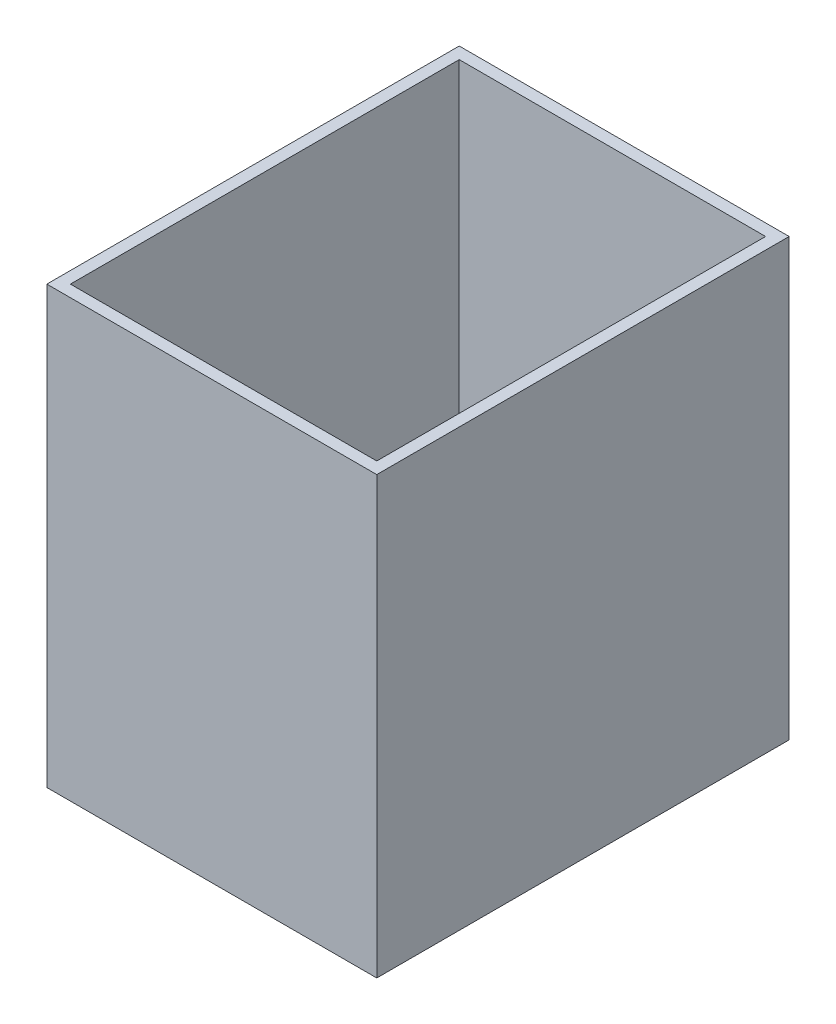
ISO-10303-21;
HEADER;
FILE_DESCRIPTION(('STEP AP214'),'2;1');
FILE_NAME('part.step','',(''),(''),'','','');
FILE_SCHEMA(('AUTOMOTIVE_DESIGN { 1 0 10303 214 1 1 1 1 }'));
ENDSEC;
DATA;
#1=APPLICATION_CONTEXT('core data for automotive mechanical design processes');
#2=APPLICATION_PROTOCOL_DEFINITION('international standard','automotive_design',2000,#1);
#3=PRODUCT_CONTEXT('',#1,'mechanical');
#4=PRODUCT('Part','Part','',(#3));
#5=PRODUCT_RELATED_PRODUCT_CATEGORY('part','',(#4));
#6=PRODUCT_DEFINITION_FORMATION('','',#4);
#7=PRODUCT_DEFINITION_CONTEXT('part definition',#1,'design');
#8=PRODUCT_DEFINITION('design','',#6,#7);
#9=PRODUCT_DEFINITION_SHAPE('','',#8);
#10=(LENGTH_UNIT() NAMED_UNIT(*) SI_UNIT(.MILLI.,.METRE.));
#11=(NAMED_UNIT(*) PLANE_ANGLE_UNIT() SI_UNIT($,.RADIAN.));
#12=(NAMED_UNIT(*) SI_UNIT($,.STERADIAN.) SOLID_ANGLE_UNIT());
#13=UNCERTAINTY_MEASURE_WITH_UNIT(LENGTH_MEASURE(1.E-05),#10,'distance_accuracy_value','');
#14=(GEOMETRIC_REPRESENTATION_CONTEXT(3) GLOBAL_UNCERTAINTY_ASSIGNED_CONTEXT((#13)) GLOBAL_UNIT_ASSIGNED_CONTEXT((#10,
#11,#12)) REPRESENTATION_CONTEXT('',''));
#15=CARTESIAN_POINT('',(0.,0.,0.));
#16=DIRECTION('',(0.,0.,1.));
#17=DIRECTION('',(1.,0.,0.));
#18=AXIS2_PLACEMENT_3D('',#15,#16,#17);
#19=CARTESIAN_POINT('',(-34.1113154934823,37.,-13.5993648044693));
#20=DIRECTION('',(0.,0.,1.));
#21=DIRECTION('',(1.,0.,0.));
#22=AXIS2_PLACEMENT_3D('',#19,#20,#21);
#23=PLANE('',#22);
#24=DIRECTION('',(-1.,0.,0.));
#25=VECTOR('',#24,1.);
#26=CARTESIAN_POINT('',(-34.1113154934823,0.,-13.5993648044693));
#27=LINE('',#26,#25);
#28=CARTESIAN_POINT('',(-6.11131549348231,0.,-13.5993648044693));
#29=VERTEX_POINT('',#28);
#30=CARTESIAN_POINT('',(-34.1113154934823,0.,-13.5993648044693));
#31=VERTEX_POINT('',#30);
#32=EDGE_CURVE('E163',#29,#31,#27,.T.);
#33=ORIENTED_EDGE('',*,*,#32,.T.);
#34=DIRECTION('',(0.,-1.,0.));
#35=VECTOR('',#34,1.);
#36=CARTESIAN_POINT('',(-34.1113154934823,37.,-13.5993648044693));
#37=LINE('',#36,#35);
#38=CARTESIAN_POINT('',(-34.1113154934823,37.,-13.5993648044693));
#39=VERTEX_POINT('',#38);
#40=EDGE_CURVE('E11',#39,#31,#37,.T.);
#41=ORIENTED_EDGE('',*,*,#40,.F.);
#42=DIRECTION('',(-1.,0.,0.));
#43=VECTOR('',#42,1.);
#44=CARTESIAN_POINT('',(-34.1113154934823,37.,-13.5993648044693));
#45=LINE('',#44,#43);
#46=CARTESIAN_POINT('',(-6.11131549348231,37.,-13.5993648044693));
#47=VERTEX_POINT('',#46);
#48=EDGE_CURVE('E169',#47,#39,#45,.T.);
#49=ORIENTED_EDGE('',*,*,#48,.F.);
#50=DIRECTION('',(0.,-1.,0.));
#51=VECTOR('',#50,1.);
#52=CARTESIAN_POINT('',(-6.11131549348231,37.,-13.5993648044693));
#53=LINE('',#52,#51);
#54=EDGE_CURVE('E179',#47,#29,#53,.T.);
#55=ORIENTED_EDGE('',*,*,#54,.T.);
#56=EDGE_LOOP('',(#33,#41,#49,#55));
#57=FACE_BOUND('',#56,.T.);
#58=ADVANCED_FACE('F45',(#57),#23,.F.);
#59=CARTESIAN_POINT('',(-34.1113154934823,37.,-13.5993648044693));
#60=DIRECTION('',(1.,0.,0.));
#61=DIRECTION('',(0.,0.,-1.));
#62=AXIS2_PLACEMENT_3D('',#59,#60,#61);
#63=PLANE('',#62);
#64=DIRECTION('',(0.,0.,1.));
#65=VECTOR('',#64,1.);
#66=CARTESIAN_POINT('',(-34.1113154934823,0.,-13.5993648044693));
#67=LINE('',#66,#65);
#68=CARTESIAN_POINT('',(-34.1113154934823,0.,21.4006351955307));
#69=VERTEX_POINT('',#68);
#70=EDGE_CURVE('E183',#31,#69,#67,.T.);
#71=ORIENTED_EDGE('',*,*,#70,.T.);
#72=DIRECTION('',(0.,-1.,0.));
#73=VECTOR('',#72,1.);
#74=CARTESIAN_POINT('',(-34.1113154934823,37.,21.4006351955307));
#75=LINE('',#74,#73);
#76=CARTESIAN_POINT('',(-34.1113154934823,37.,21.4006351955307));
#77=VERTEX_POINT('',#76);
#78=EDGE_CURVE('E53',#77,#69,#75,.T.);
#79=ORIENTED_EDGE('',*,*,#78,.F.);
#80=DIRECTION('',(0.,0.,1.));
#81=VECTOR('',#80,1.);
#82=CARTESIAN_POINT('',(-34.1113154934823,37.,-13.5993648044693));
#83=LINE('',#82,#81);
#84=EDGE_CURVE('E97',#39,#77,#83,.T.);
#85=ORIENTED_EDGE('',*,*,#84,.F.);
#86=ORIENTED_EDGE('',*,*,#40,.T.);
#87=EDGE_LOOP('',(#71,#79,#85,#86));
#88=FACE_BOUND('',#87,.T.);
#89=ADVANCED_FACE('F218',(#88),#63,.F.);
#90=CARTESIAN_POINT('',(-6.11131549348231,37.,21.4006351955307));
#91=DIRECTION('',(0.,0.,-1.));
#92=DIRECTION('',(-1.,0.,0.));
#93=AXIS2_PLACEMENT_3D('',#90,#91,#92);
#94=PLANE('',#93);
#95=DIRECTION('',(1.,0.,0.));
#96=VECTOR('',#95,1.);
#97=CARTESIAN_POINT('',(-6.11131549348231,0.,21.4006351955307));
#98=LINE('',#97,#96);
#99=CARTESIAN_POINT('',(-6.11131549348231,0.,21.4006351955307));
#100=VERTEX_POINT('',#99);
#101=EDGE_CURVE('E186',#69,#100,#98,.T.);
#102=ORIENTED_EDGE('',*,*,#101,.T.);
#103=DIRECTION('',(0.,-1.,0.));
#104=VECTOR('',#103,1.);
#105=CARTESIAN_POINT('',(-6.11131549348231,37.,21.4006351955307));
#106=LINE('',#105,#104);
#107=CARTESIAN_POINT('',(-6.11131549348231,37.,21.4006351955307));
#108=VERTEX_POINT('',#107);
#109=EDGE_CURVE('E193',#108,#100,#106,.T.);
#110=ORIENTED_EDGE('',*,*,#109,.F.);
#111=DIRECTION('',(1.,0.,0.));
#112=VECTOR('',#111,1.);
#113=CARTESIAN_POINT('',(-6.11131549348231,37.,21.4006351955307));
#114=LINE('',#113,#112);
#115=EDGE_CURVE('E174',#77,#108,#114,.T.);
#116=ORIENTED_EDGE('',*,*,#115,.F.);
#117=ORIENTED_EDGE('',*,*,#78,.T.);
#118=EDGE_LOOP('',(#102,#110,#116,#117));
#119=FACE_BOUND('',#118,.T.);
#120=ADVANCED_FACE('F200',(#119),#94,.F.);
#121=CARTESIAN_POINT('',(-6.11131549348231,37.,-13.5993648044693));
#122=DIRECTION('',(-1.,0.,0.));
#123=DIRECTION('',(0.,0.,1.));
#124=AXIS2_PLACEMENT_3D('',#121,#122,#123);
#125=PLANE('',#124);
#126=DIRECTION('',(0.,0.,-1.));
#127=VECTOR('',#126,1.);
#128=CARTESIAN_POINT('',(-6.11131549348231,0.,-13.5993648044693));
#129=LINE('',#128,#127);
#130=EDGE_CURVE('E90',#100,#29,#129,.T.);
#131=ORIENTED_EDGE('',*,*,#130,.T.);
#132=ORIENTED_EDGE('',*,*,#54,.F.);
#133=DIRECTION('',(0.,0.,-1.));
#134=VECTOR('',#133,1.);
#135=CARTESIAN_POINT('',(-6.11131549348231,37.,-13.5993648044693));
#136=LINE('',#135,#134);
#137=EDGE_CURVE('E69',#108,#47,#136,.T.);
#138=ORIENTED_EDGE('',*,*,#137,.F.);
#139=ORIENTED_EDGE('',*,*,#109,.T.);
#140=EDGE_LOOP('',(#131,#132,#138,#139));
#141=FACE_BOUND('',#140,.T.);
#142=ADVANCED_FACE('F208',(#141),#125,.F.);
#143=CARTESIAN_POINT('',(0.,37.,0.));
#144=DIRECTION('',(0.,-1.,0.));
#145=DIRECTION('',(0.,0.,-1.));
#146=AXIS2_PLACEMENT_3D('',#143,#144,#145);
#147=PLANE('',#146);
#148=DIRECTION('',(0.,0.,-1.));
#149=VECTOR('',#148,1.);
#150=CARTESIAN_POINT('',(-7.11131549348231,37.,0.));
#151=LINE('',#150,#149);
#152=CARTESIAN_POINT('',(-7.11131549348231,37.,20.4006351955307));
#153=VERTEX_POINT('',#152);
#154=CARTESIAN_POINT('',(-7.11131549348231,37.,-12.5993648044693));
#155=VERTEX_POINT('',#154);
#156=EDGE_CURVE('E154',#153,#155,#151,.T.);
#157=ORIENTED_EDGE('',*,*,#156,.F.);
#158=DIRECTION('',(1.,0.,0.));
#159=VECTOR('',#158,1.);
#160=CARTESIAN_POINT('',(0.,37.,20.4006351955307));
#161=LINE('',#160,#159);
#162=CARTESIAN_POINT('',(-33.1113154934823,37.,20.4006351955307));
#163=VERTEX_POINT('',#162);
#164=EDGE_CURVE('E60',#163,#153,#161,.T.);
#165=ORIENTED_EDGE('',*,*,#164,.F.);
#166=DIRECTION('',(0.,0.,-1.));
#167=VECTOR('',#166,1.);
#168=CARTESIAN_POINT('',(-33.1113154934823,37.,0.));
#169=LINE('',#168,#167);
#170=CARTESIAN_POINT('',(-33.1113154934823,37.,-12.5993648044693));
#171=VERTEX_POINT('',#170);
#172=EDGE_CURVE('E141',#163,#171,#169,.T.);
#173=ORIENTED_EDGE('',*,*,#172,.T.);
#174=DIRECTION('',(1.,0.,0.));
#175=VECTOR('',#174,1.);
#176=CARTESIAN_POINT('',(0.,37.,-12.5993648044693));
#177=LINE('',#176,#175);
#178=EDGE_CURVE('E145',#171,#155,#177,.T.);
#179=ORIENTED_EDGE('',*,*,#178,.T.);
#180=EDGE_LOOP('',(#157,#165,#173,#179));
#181=FACE_BOUND('',#180,.T.);
#182=ORIENTED_EDGE('',*,*,#48,.T.);
#183=ORIENTED_EDGE('',*,*,#84,.T.);
#184=ORIENTED_EDGE('',*,*,#115,.T.);
#185=ORIENTED_EDGE('',*,*,#137,.T.);
#186=EDGE_LOOP('',(#182,#183,#184,#185));
#187=FACE_BOUND('',#186,.T.);
#188=ADVANCED_FACE('F210',(#181,#187),#147,.F.);
#189=CARTESIAN_POINT('',(0.,0.,0.));
#190=DIRECTION('',(0.,-1.,0.));
#191=DIRECTION('',(0.,0.,-1.));
#192=AXIS2_PLACEMENT_3D('',#189,#190,#191);
#193=PLANE('',#192);
#194=ORIENTED_EDGE('',*,*,#32,.F.);
#195=ORIENTED_EDGE('',*,*,#130,.F.);
#196=ORIENTED_EDGE('',*,*,#101,.F.);
#197=ORIENTED_EDGE('',*,*,#70,.F.);
#198=EDGE_LOOP('',(#194,#195,#196,#197));
#199=FACE_BOUND('',#198,.T.);
#200=ADVANCED_FACE('F204',(#199),#193,.T.);
#201=CARTESIAN_POINT('',(0.,1.,20.4006351955307));
#202=DIRECTION('',(0.,0.,1.));
#203=DIRECTION('',(1.,0.,0.));
#204=AXIS2_PLACEMENT_3D('',#201,#202,#203);
#205=PLANE('',#204);
#206=ORIENTED_EDGE('',*,*,#164,.T.);
#207=DIRECTION('',(0.,1.,0.));
#208=VECTOR('',#207,1.);
#209=CARTESIAN_POINT('',(-7.11131549348231,1.,20.4006351955307));
#210=LINE('',#209,#208);
#211=CARTESIAN_POINT('',(-7.11131549348231,1.,20.4006351955307));
#212=VERTEX_POINT('',#211);
#213=EDGE_CURVE('E117',#212,#153,#210,.T.);
#214=ORIENTED_EDGE('',*,*,#213,.F.);
#215=DIRECTION('',(1.,0.,0.));
#216=VECTOR('',#215,1.);
#217=CARTESIAN_POINT('',(0.,1.,20.4006351955307));
#218=LINE('',#217,#216);
#219=CARTESIAN_POINT('',(-33.1113154934823,1.,20.4006351955307));
#220=VERTEX_POINT('',#219);
#221=EDGE_CURVE('E121',#220,#212,#218,.T.);
#222=ORIENTED_EDGE('',*,*,#221,.F.);
#223=DIRECTION('',(0.,1.,0.));
#224=VECTOR('',#223,1.);
#225=CARTESIAN_POINT('',(-33.1113154934823,1.,20.4006351955307));
#226=LINE('',#225,#224);
#227=EDGE_CURVE('E160',#220,#163,#226,.T.);
#228=ORIENTED_EDGE('',*,*,#227,.T.);
#229=EDGE_LOOP('',(#206,#214,#222,#228));
#230=FACE_BOUND('',#229,.T.);
#231=ADVANCED_FACE('F119',(#230),#205,.F.);
#232=CARTESIAN_POINT('',(-33.1113154934823,1.,0.));
#233=DIRECTION('',(1.,0.,0.));
#234=DIRECTION('',(0.,0.,-1.));
#235=AXIS2_PLACEMENT_3D('',#232,#233,#234);
#236=PLANE('',#235);
#237=ORIENTED_EDGE('',*,*,#172,.F.);
#238=ORIENTED_EDGE('',*,*,#227,.F.);
#239=DIRECTION('',(0.,0.,-1.));
#240=VECTOR('',#239,1.);
#241=CARTESIAN_POINT('',(-33.1113154934823,1.,0.));
#242=LINE('',#241,#240);
#243=CARTESIAN_POINT('',(-33.1113154934823,1.,-12.5993648044693));
#244=VERTEX_POINT('',#243);
#245=EDGE_CURVE('E127',#220,#244,#242,.T.);
#246=ORIENTED_EDGE('',*,*,#245,.T.);
#247=DIRECTION('',(0.,1.,0.));
#248=VECTOR('',#247,1.);
#249=CARTESIAN_POINT('',(-33.1113154934823,1.,-12.5993648044693));
#250=LINE('',#249,#248);
#251=EDGE_CURVE('E164',#244,#171,#250,.T.);
#252=ORIENTED_EDGE('',*,*,#251,.T.);
#253=EDGE_LOOP('',(#237,#238,#246,#252));
#254=FACE_BOUND('',#253,.T.);
#255=ADVANCED_FACE('F257',(#254),#236,.T.);
#256=CARTESIAN_POINT('',(0.,1.,-12.5993648044693));
#257=DIRECTION('',(0.,0.,1.));
#258=DIRECTION('',(1.,0.,0.));
#259=AXIS2_PLACEMENT_3D('',#256,#257,#258);
#260=PLANE('',#259);
#261=ORIENTED_EDGE('',*,*,#178,.F.);
#262=ORIENTED_EDGE('',*,*,#251,.F.);
#263=DIRECTION('',(1.,0.,0.));
#264=VECTOR('',#263,1.);
#265=CARTESIAN_POINT('',(0.,1.,-12.5993648044693));
#266=LINE('',#265,#264);
#267=CARTESIAN_POINT('',(-7.11131549348231,1.,-12.5993648044693));
#268=VERTEX_POINT('',#267);
#269=EDGE_CURVE('E136',#244,#268,#266,.T.);
#270=ORIENTED_EDGE('',*,*,#269,.T.);
#271=DIRECTION('',(0.,1.,0.));
#272=VECTOR('',#271,1.);
#273=CARTESIAN_POINT('',(-7.11131549348231,1.,-12.5993648044693));
#274=LINE('',#273,#272);
#275=EDGE_CURVE('E126',#268,#155,#274,.T.);
#276=ORIENTED_EDGE('',*,*,#275,.T.);
#277=EDGE_LOOP('',(#261,#262,#270,#276));
#278=FACE_BOUND('',#277,.T.);
#279=ADVANCED_FACE('F266',(#278),#260,.T.);
#280=CARTESIAN_POINT('',(-7.11131549348231,1.,0.));
#281=DIRECTION('',(1.,0.,0.));
#282=DIRECTION('',(0.,0.,-1.));
#283=AXIS2_PLACEMENT_3D('',#280,#281,#282);
#284=PLANE('',#283);
#285=ORIENTED_EDGE('',*,*,#156,.T.);
#286=ORIENTED_EDGE('',*,*,#275,.F.);
#287=DIRECTION('',(0.,0.,-1.));
#288=VECTOR('',#287,1.);
#289=CARTESIAN_POINT('',(-7.11131549348231,1.,0.));
#290=LINE('',#289,#288);
#291=EDGE_CURVE('E131',#212,#268,#290,.T.);
#292=ORIENTED_EDGE('',*,*,#291,.F.);
#293=ORIENTED_EDGE('',*,*,#213,.T.);
#294=EDGE_LOOP('',(#285,#286,#292,#293));
#295=FACE_BOUND('',#294,.T.);
#296=ADVANCED_FACE('F132',(#295),#284,.F.);
#297=CARTESIAN_POINT('',(0.,1.,0.));
#298=DIRECTION('',(0.,1.,0.));
#299=DIRECTION('',(0.,0.,1.));
#300=AXIS2_PLACEMENT_3D('',#297,#298,#299);
#301=PLANE('',#300);
#302=ORIENTED_EDGE('',*,*,#221,.T.);
#303=ORIENTED_EDGE('',*,*,#291,.T.);
#304=ORIENTED_EDGE('',*,*,#269,.F.);
#305=ORIENTED_EDGE('',*,*,#245,.F.);
#306=EDGE_LOOP('',(#302,#303,#304,#305));
#307=FACE_BOUND('',#306,.T.);
#308=ADVANCED_FACE('F139',(#307),#301,.T.);
#309=CLOSED_SHELL('',(#58,#89,#120,#142,#188,#200,#231,#255,#279,#296,#308));
#310=MANIFOLD_SOLID_BREP('B2',#309);
#311=ADVANCED_BREP_SHAPE_REPRESENTATION('',(#18,#310),#14);
#312=SHAPE_DEFINITION_REPRESENTATION(#9,#311);
ENDSEC;
END-ISO-10303-21;
